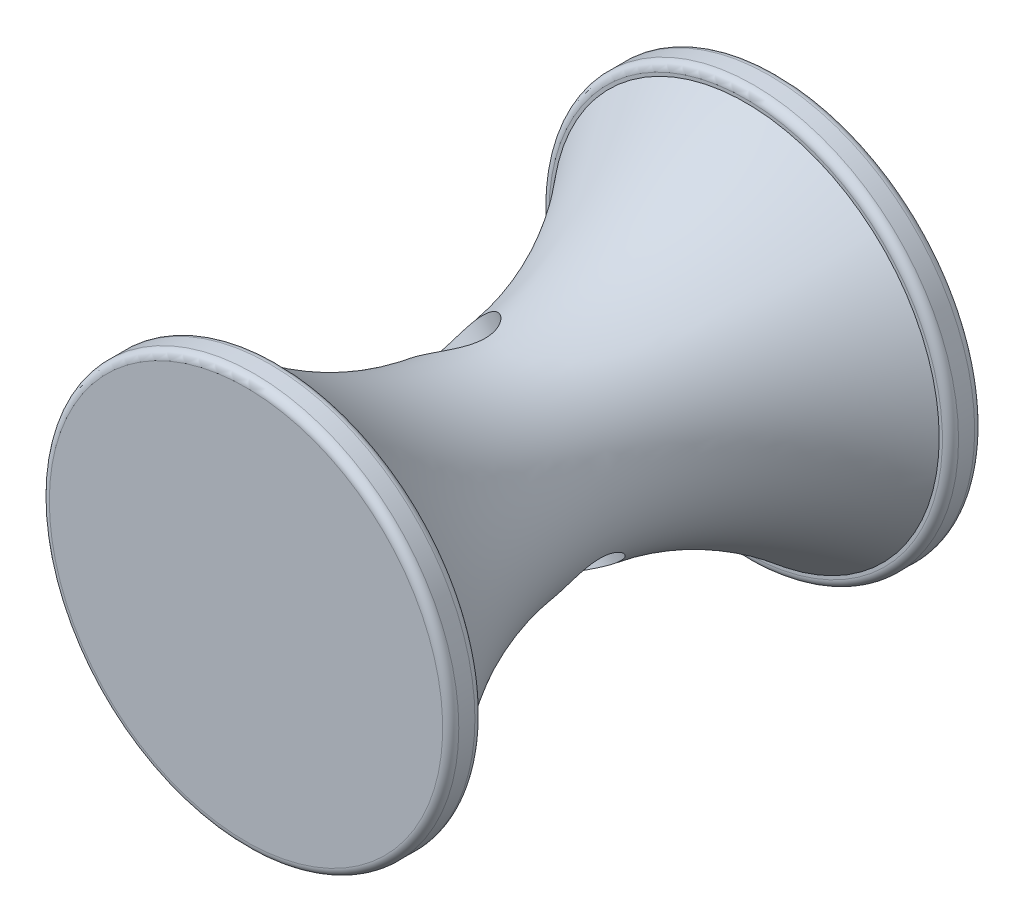
ISO-10303-21;
HEADER;
FILE_DESCRIPTION(('STEP AP214'),'2;1');
FILE_NAME('part.step','',(''),(''),'','','');
FILE_SCHEMA(('AUTOMOTIVE_DESIGN { 1 0 10303 214 1 1 1 1 }'));
ENDSEC;
DATA;
#1=APPLICATION_CONTEXT('core data for automotive mechanical design processes');
#2=APPLICATION_PROTOCOL_DEFINITION('international standard','automotive_design',2000,#1);
#3=PRODUCT_CONTEXT('',#1,'mechanical');
#4=PRODUCT('Part','Part','',(#3));
#5=PRODUCT_RELATED_PRODUCT_CATEGORY('part','',(#4));
#6=PRODUCT_DEFINITION_FORMATION('','',#4);
#7=PRODUCT_DEFINITION_CONTEXT('part definition',#1,'design');
#8=PRODUCT_DEFINITION('design','',#6,#7);
#9=PRODUCT_DEFINITION_SHAPE('','',#8);
#10=(LENGTH_UNIT() NAMED_UNIT(*) SI_UNIT(.MILLI.,.METRE.));
#11=(NAMED_UNIT(*) PLANE_ANGLE_UNIT() SI_UNIT($,.RADIAN.));
#12=(NAMED_UNIT(*) SI_UNIT($,.STERADIAN.) SOLID_ANGLE_UNIT());
#13=UNCERTAINTY_MEASURE_WITH_UNIT(LENGTH_MEASURE(1.E-05),#10,'distance_accuracy_value','');
#14=(GEOMETRIC_REPRESENTATION_CONTEXT(3) GLOBAL_UNCERTAINTY_ASSIGNED_CONTEXT((#13)) GLOBAL_UNIT_ASSIGNED_CONTEXT((#10,
#11,#12)) REPRESENTATION_CONTEXT('',''));
#15=CARTESIAN_POINT('',(0.,0.,0.));
#16=DIRECTION('',(0.,0.,1.));
#17=DIRECTION('',(1.,0.,0.));
#18=AXIS2_PLACEMENT_3D('',#15,#16,#17);
#19=CARTESIAN_POINT('',(0.,0.,-7.));
#20=DIRECTION('',(0.,0.,1.));
#21=DIRECTION('',(1.,0.,0.));
#22=AXIS2_PLACEMENT_3D('',#19,#20,#21);
#23=CYLINDRICAL_SURFACE('',#22,5.);
#24=CARTESIAN_POINT('',(0.,0.,-6.5));
#25=DIRECTION('',(0.,0.,-1.));
#26=DIRECTION('',(-1.,0.,0.));
#27=AXIS2_PLACEMENT_3D('',#24,#25,#26);
#28=CIRCLE('',#27,5.);
#29=CARTESIAN_POINT('',(-5.,0.,-6.5));
#30=VERTEX_POINT('',#29);
#31=EDGE_CURVE('E56',#30,#30,#28,.F.);
#32=ORIENTED_EDGE('',*,*,#31,.T.);
#33=EDGE_LOOP('',(#32));
#34=FACE_BOUND('',#33,.T.);
#35=CARTESIAN_POINT('',(0.,0.,-2.5));
#36=DIRECTION('',(0.,0.,-1.));
#37=DIRECTION('',(-1.,0.,0.));
#38=AXIS2_PLACEMENT_3D('',#35,#36,#37);
#39=CIRCLE('',#38,5.);
#40=CARTESIAN_POINT('',(-5.,0.,-2.5));
#41=VERTEX_POINT('',#40);
#42=EDGE_CURVE('E60',#41,#41,#39,.T.);
#43=ORIENTED_EDGE('',*,*,#42,.T.);
#44=EDGE_LOOP('',(#43));
#45=FACE_BOUND('',#44,.T.);
#46=CARTESIAN_POINT('',(-2.60900254684308,4.26533770181991,-4.5));
#47=CARTESIAN_POINT('',(-2.60900443382796,4.26533711327154,-4.4553733138568));
#48=CARTESIAN_POINT('',(-2.61224345294259,4.26336053445831,-4.41072162366317));
#49=CARTESIAN_POINT('',(-2.62507600880975,4.2554706571707,-4.32266926107481));
#50=CARTESIAN_POINT('',(-2.63467554499666,4.2495536419293,-4.27926981020067));
#51=CARTESIAN_POINT('',(-2.65983460101984,4.2338514713494,-4.19500907475503));
#52=CARTESIAN_POINT('',(-2.67538930778719,4.22406943957826,-4.1541457713407));
#53=CARTESIAN_POINT('',(-2.71185698764664,4.20074968922989,-4.07605340784582));
#54=CARTESIAN_POINT('',(-2.73276930240486,4.18721243207155,-4.03882390202596));
#55=CARTESIAN_POINT('',(-2.77937816959238,4.15642168396467,-3.96871242688156));
#56=CARTESIAN_POINT('',(-2.8051122625627,4.13913885362266,-3.93586829379598));
#57=CARTESIAN_POINT('',(-2.86034256689951,4.1011658480446,-3.87578821613603));
#58=CARTESIAN_POINT('',(-2.88983899432764,4.08047547710194,-3.84855259387972));
#59=CARTESIAN_POINT('',(-2.95176343119985,4.03590802300632,-3.8003216154833));
#60=CARTESIAN_POINT('',(-2.98420663985308,4.01201407539377,-3.77936132386475));
#61=CARTESIAN_POINT('',(-3.0508062003771,3.96160618261597,-3.74450122437601));
#62=CARTESIAN_POINT('',(-3.08496244935503,3.93509239471747,-3.73060099300373));
#63=CARTESIAN_POINT('',(-3.15359457175549,3.88030308154958,-3.71037090225503));
#64=CARTESIAN_POINT('',(-3.18806524255034,3.85204449095762,-3.70397755223796));
#65=CARTESIAN_POINT('',(-3.25655980146,3.79431464540323,-3.69874539676572));
#66=CARTESIAN_POINT('',(-3.2905837175301,3.76484346679909,-3.69990611634203));
#67=CARTESIAN_POINT('',(-3.35690513771445,3.70582531630776,-3.70969939427401));
#68=CARTESIAN_POINT('',(-3.3892155684742,3.67628149339075,-3.71826363369893));
#69=CARTESIAN_POINT('',(-3.45160590242494,3.61776824619765,-3.74251340584986));
#70=CARTESIAN_POINT('',(-3.48168574189487,3.58879883834812,-3.75819914192376));
#71=CARTESIAN_POINT('',(-3.53903429460917,3.53226078879275,-3.79631538348004));
#72=CARTESIAN_POINT('',(-3.5662905079494,3.50469862859788,-3.81877429095832));
#73=CARTESIAN_POINT('',(-3.61727478178309,3.45205274895665,-3.8697785714468));
#74=CARTESIAN_POINT('',(-3.64100257841022,3.42696921491694,-3.89832439926831));
#75=CARTESIAN_POINT('',(-3.68472454236486,3.37991864423674,-3.9610718254241));
#76=CARTESIAN_POINT('',(-3.70467398231077,3.35798960220132,-3.99533311033636));
#77=CARTESIAN_POINT('',(-3.74014960786449,3.3184317230795,-4.06833710250877));
#78=CARTESIAN_POINT('',(-3.75567575862041,3.30080291987564,-4.10707984507576));
#79=CARTESIAN_POINT('',(-3.7820516732753,3.27054893242898,-4.1880122039828));
#80=CARTESIAN_POINT('',(-3.79289687708267,3.25792862833217,-4.23020513406254));
#81=CARTESIAN_POINT('',(-3.80970250164521,3.23826123114849,-4.31680424865733));
#82=CARTESIAN_POINT('',(-3.81566331684459,3.23121368802874,-4.36121025414573));
#83=CARTESIAN_POINT('',(-3.82256033187884,3.2230515285817,-4.45045112906938));
#84=CARTESIAN_POINT('',(-3.82355115776807,3.22187241243453,-4.49527588587375));
#85=CARTESIAN_POINT('',(-3.82063914040817,3.22532501670492,-4.58453958650626));
#86=CARTESIAN_POINT('',(-3.81673647076437,3.22995653098019,-4.628978543965));
#87=CARTESIAN_POINT('',(-3.80414080015943,3.24478127374899,-4.71594676217776));
#88=CARTESIAN_POINT('',(-3.79547559320324,3.25494222924468,-4.75848556927231));
#89=CARTESIAN_POINT('',(-3.77351750854249,3.28037286859459,-4.84074815480667));
#90=CARTESIAN_POINT('',(-3.76022437368658,3.29564283632984,-4.88047177667274));
#91=CARTESIAN_POINT('',(-3.72909705437417,3.33082413724014,-4.95634895723258));
#92=CARTESIAN_POINT('',(-3.71122511058486,3.35077394147325,-4.99246918142802));
#93=CARTESIAN_POINT('',(-3.67130326423956,3.39446695827805,-5.0597704242547));
#94=CARTESIAN_POINT('',(-3.64925309168761,3.41821041597901,-5.09095112345601));
#95=CARTESIAN_POINT('',(-3.60114808870132,3.46885592523356,-5.14779091683714));
#96=CARTESIAN_POINT('',(-3.57505705745574,3.49578595125553,-5.17339449164431));
#97=CARTESIAN_POINT('',(-3.51956233548919,3.55165157383198,-5.2179652183954));
#98=CARTESIAN_POINT('',(-3.49015874533044,3.58058710949321,-5.23693257172912));
#99=CARTESIAN_POINT('',(-3.42884126323115,3.63934633375815,-5.26760508960748));
#100=CARTESIAN_POINT('',(-3.39693820900117,3.66916587358044,-5.2793398424944));
#101=CARTESIAN_POINT('',(-3.33133236744525,3.7288321698403,-5.295309534557));
#102=CARTESIAN_POINT('',(-3.29762971631576,3.75867892405067,-5.29954504046161));
#103=CARTESIAN_POINT('',(-3.22975053470155,3.81715814532049,-5.30038071923171));
#104=CARTESIAN_POINT('',(-3.19558348776587,3.8458004454421,-5.29706555976116));
#105=CARTESIAN_POINT('',(-3.12741574243433,3.90143652879362,-5.28307646469127));
#106=CARTESIAN_POINT('',(-3.09341504328036,3.92843031954281,-5.2724025626598));
#107=CARTESIAN_POINT('',(-3.02665808428816,3.98009071234288,-5.24403047006883));
#108=CARTESIAN_POINT('',(-2.99390067811688,4.00475949083369,-5.22633893118066));
#109=CARTESIAN_POINT('',(-2.93063389282212,4.05128731381145,-5.18444301584855));
#110=CARTESIAN_POINT('',(-2.90012460668067,4.07314624211108,-5.16023837021556));
#111=CARTESIAN_POINT('',(-2.84204445648546,4.11388585944119,-5.1057006718458));
#112=CARTESIAN_POINT('',(-2.81450815420948,4.13273253604469,-5.07530539880373));
#113=CARTESIAN_POINT('',(-2.76369723751501,4.16688339537049,-5.0093800524562));
#114=CARTESIAN_POINT('',(-2.74042362313658,4.18218674703944,-4.97384877771776));
#115=CARTESIAN_POINT('',(-2.69885577409325,4.20913255859979,-4.89838833042705));
#116=CARTESIAN_POINT('',(-2.68059469134936,4.22075072035152,-4.85843221987585));
#117=CARTESIAN_POINT('',(-2.64997553052222,4.24004245285957,-4.7754566841129));
#118=CARTESIAN_POINT('',(-2.63761146095782,4.2477200279359,-4.73244041937775));
#119=CARTESIAN_POINT('',(-2.62200227858149,4.25736525548576,-4.65770481675488));
#120=CARTESIAN_POINT('',(-2.61713734578481,4.26035289216209,-4.62644188261262));
#121=CARTESIAN_POINT('',(-2.61063683464042,4.26433930879072,-4.56345684217454));
#122=CARTESIAN_POINT('',(-2.60900120497825,4.26533812034597,-4.53173474318303));
#123=CARTESIAN_POINT('',(-2.60900254684308,4.26533770181991,-4.5));
#124=B_SPLINE_CURVE_WITH_KNOTS('',3,(#46,#47,#48,#49,#50,#51,#52,#53,#54,#55,#56,#57,#58,#59,
#60,#61,#62,#63,#64,#65,#66,#67,#68,#69,#70,#71,#72,#73,#74,#75,#76,#77,#78,#79,#80,#81,#82,#83,
#84,#85,#86,#87,#88,#89,#90,#91,#92,#93,#94,#95,#96,#97,#98,#99,#100,#101,#102,#103,#104,#105,
#106,#107,#108,#109,#110,#111,#112,#113,#114,#115,#116,#117,#118,#119,#120,#121,#122,#123),
.UNSPECIFIED.,.T.,.F.,(4,2,2,2,2,2,2,2,2,2,2,2,2,2,2,2,2,2,2,2,2,2,2,2,2,2,2,2,2,2,2,2,2,2,2,2,
2,2,4),(0.,0.133764032978237,0.267654416240317,0.40143681470898,0.53520278209898,
0.670057077330425,0.804919120403269,0.940521238000382,1.07611522045936,1.21055394043864,
1.34498420755128,1.47818704938263,1.61139369493982,1.74516687269947,1.87895004942165,
2.01422953733835,2.14951009111741,2.28492213686848,2.42032324619167,2.55423282532142,
2.68813765390886,2.82126919083117,2.95440812640361,3.08868247170647,3.22296549674049,
3.35852970160144,3.49408979213061,3.62909156425651,3.76408313366813,3.89756846817801,
4.03105319378108,4.16441169698711,4.29777571279495,4.43255288424274,4.56736163445245,
4.70304160363671,4.83858342408627,4.93370665764447,5.0288283796578),.UNSPECIFIED.);
#125=CARTESIAN_POINT('',(-2.60900254684308,4.26533770181991,-4.5));
#126=VERTEX_POINT('',#125);
#127=EDGE_CURVE('E193',#126,#126,#124,.T.);
#128=ORIENTED_EDGE('',*,*,#127,.T.);
#129=EDGE_LOOP('',(#128));
#130=FACE_BOUND('',#129,.T.);
#131=ADVANCED_FACE('F45',(#34,#45,#130),#23,.T.);
#132=CARTESIAN_POINT('',(0.,0.,2.));
#133=DIRECTION('',(0.,0.,-1.));
#134=DIRECTION('',(-1.,0.,0.));
#135=AXIS2_PLACEMENT_3D('',#132,#133,#134);
#136=CYLINDRICAL_SURFACE('',#135,2.);
#137=CARTESIAN_POINT('',(0.,0.,2.));
#138=DIRECTION('',(0.,0.,1.));
#139=DIRECTION('',(1.,0.,0.));
#140=AXIS2_PLACEMENT_3D('',#137,#138,#139);
#141=CIRCLE('',#140,2.);
#142=CARTESIAN_POINT('',(2.,0.,2.));
#143=VERTEX_POINT('',#142);
#144=EDGE_CURVE('E101',#143,#143,#141,.T.);
#145=ORIENTED_EDGE('',*,*,#144,.T.);
#146=EDGE_LOOP('',(#145));
#147=FACE_BOUND('',#146,.T.);
#148=CARTESIAN_POINT('',(0.,0.,-6.5));
#149=DIRECTION('',(0.,0.,-1.));
#150=DIRECTION('',(-1.,0.,0.));
#151=AXIS2_PLACEMENT_3D('',#148,#149,#150);
#152=CIRCLE('',#151,2.);
#153=CARTESIAN_POINT('',(-2.,0.,-6.5));
#154=VERTEX_POINT('',#153);
#155=EDGE_CURVE('E52',#154,#154,#152,.T.);
#156=ORIENTED_EDGE('',*,*,#155,.T.);
#157=EDGE_LOOP('',(#156));
#158=FACE_BOUND('',#157,.T.);
#159=CARTESIAN_POINT('',(-0.587474123760921,1.91177251625588,-4.5));
#160=CARTESIAN_POINT('',(-0.587480508265207,1.91177273864032,-4.45714420076004));
#161=CARTESIAN_POINT('',(-0.591095009578166,1.91067162442174,-4.41422778611812));
#162=CARTESIAN_POINT('',(-0.605331242673582,1.90620723186134,-4.32962606684917));
#163=CARTESIAN_POINT('',(-0.615970879870037,1.9028381726333,-4.2879441931678));
#164=CARTESIAN_POINT('',(-0.643533364880496,1.89369301682181,-4.20717882321198));
#165=CARTESIAN_POINT('',(-0.660432534108798,1.88792598136304,-4.1680861810559));
#166=CARTESIAN_POINT('',(-0.69960927466876,1.8737606457941,-4.09324597965615));
#167=CARTESIAN_POINT('',(-0.721885671568623,1.86536292012972,-4.05749769233965));
#168=CARTESIAN_POINT('',(-0.772115479648568,1.84515756588624,-3.98829583910342));
#169=CARTESIAN_POINT('',(-0.800303394826233,1.83319568093306,-3.95505743082821));
#170=CARTESIAN_POINT('',(-0.86040862196621,1.80576510433217,-3.89378840107385));
#171=CARTESIAN_POINT('',(-0.892327230865594,1.79029519138727,-3.86575959948406));
#172=CARTESIAN_POINT('',(-0.960030802762707,1.75495116248972,-3.81463744120692));
#173=CARTESIAN_POINT('',(-0.995918593943286,1.73492743437871,-3.79178227941174));
#174=CARTESIAN_POINT('',(-1.06905074185706,1.69084279225603,-3.75326257264408));
#175=CARTESIAN_POINT('',(-1.10629453990706,1.66678352649843,-3.73759510168722));
#176=CARTESIAN_POINT('',(-1.17887459669896,1.61620396124279,-3.71466340542504));
#177=CARTESIAN_POINT('',(-1.21421591215646,1.58985919911323,-3.70702907436439));
#178=CARTESIAN_POINT('',(-1.28354310840504,1.53443270102363,-3.69918860573492));
#179=CARTESIAN_POINT('',(-1.31752949001489,1.50535198994922,-3.69897969762606));
#180=CARTESIAN_POINT('',(-1.38120212688349,1.44707981012738,-3.70579310790999));
#181=CARTESIAN_POINT('',(-1.4110226907521,1.41798631350338,-3.71240990909877));
#182=CARTESIAN_POINT('',(-1.46778551237587,1.35914589974983,-3.7319971505243));
#183=CARTESIAN_POINT('',(-1.49472755875822,1.32939893482846,-3.74496805696016));
#184=CARTESIAN_POINT('',(-1.5456773093787,1.26981991443307,-3.77705459315052));
#185=CARTESIAN_POINT('',(-1.56963466933303,1.23999333342563,-3.79625988592621));
#186=CARTESIAN_POINT('',(-1.6139391717264,1.1817534741465,-3.8401860027676));
#187=CARTESIAN_POINT('',(-1.63428507248995,1.15334068436508,-3.86490871723905));
#188=CARTESIAN_POINT('',(-1.67256033053794,1.09716552742608,-3.92105965437864));
#189=CARTESIAN_POINT('',(-1.69024332842907,1.06956833815165,-3.95282155703353));
#190=CARTESIAN_POINT('',(-1.72158275513892,1.0183595287229,-4.02119622872839));
#191=CARTESIAN_POINT('',(-1.73523786650214,0.994749213686825,-4.05781057926167));
#192=CARTESIAN_POINT('',(-1.75898713291831,0.952143752751025,-4.13616760896358));
#193=CARTESIAN_POINT('',(-1.76896980844902,0.933297807116408,-4.17802593219353));
#194=CARTESIAN_POINT('',(-1.78493944689584,0.902384356932608,-4.26488619618481));
#195=CARTESIAN_POINT('',(-1.79092900529976,0.890312450132704,-4.30988607390834));
#196=CARTESIAN_POINT('',(-1.79875011734727,0.874398298324142,-4.39881431097442));
#197=CARTESIAN_POINT('',(-1.80081333945623,0.870098337912879,-4.44264017884807));
#198=CARTESIAN_POINT('',(-1.80151351578428,0.868648690121766,-4.53043088310718));
#199=CARTESIAN_POINT('',(-1.80015150901674,0.871496834426021,-4.57439567331114));
#200=CARTESIAN_POINT('',(-1.79416609168745,0.883747160284599,-4.65858357398195));
#201=CARTESIAN_POINT('',(-1.78973285445757,0.892766813800205,-4.6988771749598));
#202=CARTESIAN_POINT('',(-1.77776656042316,0.916362238045212,-4.7773153619144));
#203=CARTESIAN_POINT('',(-1.77023281627608,0.930939240714714,-4.81545946924293));
#204=CARTESIAN_POINT('',(-1.75161796555995,0.965522608838415,-4.8902409431182));
#205=CARTESIAN_POINT('',(-1.74040539137102,0.98572518016674,-4.92675447547778));
#206=CARTESIAN_POINT('',(-1.71442443196069,1.03024875099509,-4.99579319497667));
#207=CARTESIAN_POINT('',(-1.699654598122,1.0545714271187,-5.02831674911824));
#208=CARTESIAN_POINT('',(-1.66521702891769,1.1082146965867,-5.09094936343969));
#209=CARTESIAN_POINT('',(-1.64526809440035,1.1377717558601,-5.12070262611641));
#210=CARTESIAN_POINT('',(-1.60108177583057,1.19915197415681,-5.17407083064414));
#211=CARTESIAN_POINT('',(-1.57684421728713,1.23097522535305,-5.19768552263889));
#212=CARTESIAN_POINT('',(-1.52422267402554,1.29556077018634,-5.23801905058449));
#213=CARTESIAN_POINT('',(-1.49583968432722,1.3283228369687,-5.25473953766631));
#214=CARTESIAN_POINT('',(-1.43538728775364,1.39342447745639,-5.28061954096305));
#215=CARTESIAN_POINT('',(-1.40331989231251,1.42576427105516,-5.28978316057603));
#216=CARTESIAN_POINT('',(-1.33852953099021,1.48666950214906,-5.29980188065015));
#217=CARTESIAN_POINT('',(-1.3059858387739,1.51534353056528,-5.30116005138506));
#218=CARTESIAN_POINT('',(-1.23937683076276,1.57028912431096,-5.29685780828636));
#219=CARTESIAN_POINT('',(-1.20531174605507,1.59656105266504,-5.29119845688575));
#220=CARTESIAN_POINT('',(-1.1378420485084,1.64529517767497,-5.27338128465661));
#221=CARTESIAN_POINT('',(-1.10444929045789,1.66784961083155,-5.26142842156978));
#222=CARTESIAN_POINT('',(-1.03834332615131,1.70978858810531,-5.23157887817527));
#223=CARTESIAN_POINT('',(-1.00563024641487,1.72917254658433,-5.21368110159186));
#224=CARTESIAN_POINT('',(-0.940496322213059,1.76547966066201,-5.17155872060426));
#225=CARTESIAN_POINT('',(-0.908152273380605,1.78225621980868,-5.14708948204597));
#226=CARTESIAN_POINT('',(-0.846410476507775,1.81239391037479,-5.09288459232843));
#227=CARTESIAN_POINT('',(-0.817013955849432,1.82575362254422,-5.06314676141595));
#228=CARTESIAN_POINT('',(-0.760538926226902,1.85002253893008,-4.99707391018998));
#229=CARTESIAN_POINT('',(-0.733716572892752,1.86072884358772,-4.96044445063955));
#230=CARTESIAN_POINT('',(-0.685865914442591,1.87889487590581,-4.88282314502849));
#231=CARTESIAN_POINT('',(-0.664838290573624,1.88635422190305,-4.84183078683605));
#232=CARTESIAN_POINT('',(-0.63137263516463,1.89780220785649,-4.76038511926077));
#233=CARTESIAN_POINT('',(-0.618332869015673,1.90204234563157,-4.72021390609953));
#234=CARTESIAN_POINT('',(-0.598849918812396,1.90826814538805,-4.63820583214786));
#235=CARTESIAN_POINT('',(-0.592388354483347,1.91026009078861,-4.59637395361321));
#236=CARTESIAN_POINT('',(-0.588114454578556,1.91157522554629,-4.53624897506483));
#237=CARTESIAN_POINT('',(-0.587471422831283,1.91177242217735,-4.51812991160096));
#238=CARTESIAN_POINT('',(-0.587474123760921,1.91177251625588,-4.5));
#239=B_SPLINE_CURVE_WITH_KNOTS('',3,(#159,#160,#161,#162,#163,#164,#165,#166,#167,#168,#169,
#170,#171,#172,#173,#174,#175,#176,#177,#178,#179,#180,#181,#182,#183,#184,#185,#186,#187,#188,
#189,#190,#191,#192,#193,#194,#195,#196,#197,#198,#199,#200,#201,#202,#203,#204,#205,#206,#207,
#208,#209,#210,#211,#212,#213,#214,#215,#216,#217,#218,#219,#220,#221,#222,#223,#224,#225,#226,
#227,#228,#229,#230,#231,#232,#233,#234,#235,#236,#237,#238),.UNSPECIFIED.,.T.,.F.,(4,2,2,2,2,2,
2,2,2,2,2,2,2,2,2,2,2,2,2,2,2,2,2,2,2,2,2,2,2,2,2,2,2,2,2,2,2,2,2,4),(0.,0.128511059507061,
0.257350934328899,0.385708329317358,0.514037715295447,0.6490224731377,0.784054297393372,
0.924410676365716,1.06470986787792,1.19821673154874,1.33167378122269,1.45763457932121,
1.58360462051624,1.71147320093959,1.83938565976013,1.97569617632542,2.11205122850851,
2.25225783485831,2.39237321917645,2.52392859007372,2.6554440596078,2.77946899231662,
2.90352143458259,3.03260461858685,3.16174045807944,3.30041493696396,3.43909505938703,
3.57774194922729,3.71631350379259,3.84584415899985,3.97535520602645,4.10088797774945,
4.22644391129038,4.35754820453574,4.48870686623287,4.6279850131185,4.7672795270128,
4.89406664325235,5.02049852085302,5.07486442208293),.UNSPECIFIED.);
#240=CARTESIAN_POINT('',(-0.587474123760921,1.91177251625588,-4.5));
#241=VERTEX_POINT('',#240);
#242=EDGE_CURVE('E192',#241,#241,#239,.T.);
#243=ORIENTED_EDGE('',*,*,#242,.F.);
#244=EDGE_LOOP('',(#243));
#245=FACE_BOUND('',#244,.T.);
#246=ADVANCED_FACE('F133',(#147,#158,#245),#136,.F.);
#247=CARTESIAN_POINT('',(0.,0.,-2.));
#248=DIRECTION('',(0.,0.,-1.));
#249=DIRECTION('',(-1.,0.,0.));
#250=AXIS2_PLACEMENT_3D('',#247,#248,#249);
#251=PLANE('',#250);
#252=CARTESIAN_POINT('',(0.,0.,-2.));
#253=DIRECTION('',(0.,0.,-1.));
#254=DIRECTION('',(-1.,0.,0.));
#255=AXIS2_PLACEMENT_3D('',#252,#253,#254);
#256=CIRCLE('',#255,5.5);
#257=CARTESIAN_POINT('',(-5.5,0.,-2.));
#258=VERTEX_POINT('',#257);
#259=EDGE_CURVE('E10',#258,#258,#256,.F.);
#260=ORIENTED_EDGE('',*,*,#259,.T.);
#261=EDGE_LOOP('',(#260));
#262=FACE_BOUND('',#261,.T.);
#263=CARTESIAN_POINT('',(0.,0.,-2.));
#264=DIRECTION('',(0.,0.,-1.));
#265=DIRECTION('',(-1.,0.,0.));
#266=AXIS2_PLACEMENT_3D('',#263,#264,#265);
#267=CIRCLE('',#266,12.2);
#268=CARTESIAN_POINT('',(-12.2,0.,-2.));
#269=VERTEX_POINT('',#268);
#270=EDGE_CURVE('E74',#269,#269,#267,.T.);
#271=ORIENTED_EDGE('',*,*,#270,.T.);
#272=EDGE_LOOP('',(#271));
#273=FACE_BOUND('',#272,.T.);
#274=ADVANCED_FACE('F129',(#262,#273),#251,.T.);
#275=CARTESIAN_POINT('',(0.,0.,31.));
#276=DIRECTION('',(0.,0.,-1.));
#277=DIRECTION('',(-1.,0.,0.));
#278=AXIS2_PLACEMENT_3D('',#275,#276,#277);
#279=PLANE('',#278);
#280=CARTESIAN_POINT('',(0.,0.,31.));
#281=DIRECTION('',(0.,0.,-1.));
#282=DIRECTION('',(-1.,0.,0.));
#283=AXIS2_PLACEMENT_3D('',#280,#281,#282);
#284=CIRCLE('',#283,12.2);
#285=CARTESIAN_POINT('',(-12.2,0.,31.));
#286=VERTEX_POINT('',#285);
#287=EDGE_CURVE('E71',#286,#286,#284,.F.);
#288=ORIENTED_EDGE('',*,*,#287,.T.);
#289=EDGE_LOOP('',(#288));
#290=FACE_BOUND('',#289,.T.);
#291=ADVANCED_FACE('F125',(#290),#279,.F.);
#292=CARTESIAN_POINT('',(0.,0.,0.));
#293=DIRECTION('',(0.,0.,-1.));
#294=DIRECTION('',(-1.,0.,0.));
#295=AXIS2_PLACEMENT_3D('',#292,#293,#294);
#296=CYLINDRICAL_SURFACE('',#295,12.7);
#297=CARTESIAN_POINT('',(0.,0.,29.5));
#298=DIRECTION('',(0.,0.,-1.));
#299=DIRECTION('',(-1.,0.,0.));
#300=AXIS2_PLACEMENT_3D('',#297,#298,#299);
#301=CIRCLE('',#300,12.7);
#302=CARTESIAN_POINT('',(-12.7,0.,29.5));
#303=VERTEX_POINT('',#302);
#304=EDGE_CURVE('E86',#303,#303,#301,.F.);
#305=ORIENTED_EDGE('',*,*,#304,.T.);
#306=EDGE_LOOP('',(#305));
#307=FACE_BOUND('',#306,.T.);
#308=CARTESIAN_POINT('',(0.,0.,30.5));
#309=DIRECTION('',(0.,0.,-1.));
#310=DIRECTION('',(-1.,0.,0.));
#311=AXIS2_PLACEMENT_3D('',#308,#309,#310);
#312=CIRCLE('',#311,12.7);
#313=CARTESIAN_POINT('',(-12.7,0.,30.5));
#314=VERTEX_POINT('',#313);
#315=EDGE_CURVE('E89',#314,#314,#312,.T.);
#316=ORIENTED_EDGE('',*,*,#315,.T.);
#317=EDGE_LOOP('',(#316));
#318=FACE_BOUND('',#317,.T.);
#319=ADVANCED_FACE('F121',(#307,#318),#296,.T.);
#320=CARTESIAN_POINT('',(0.,0.,29.));
#321=DIRECTION('',(0.,0.,-1.));
#322=DIRECTION('',(-1.,0.,0.));
#323=AXIS2_PLACEMENT_3D('',#320,#321,#322);
#324=PLANE('',#323);
#325=CARTESIAN_POINT('',(0.,0.,29.));
#326=DIRECTION('',(0.,0.,-1.));
#327=DIRECTION('',(-1.,0.,0.));
#328=AXIS2_PLACEMENT_3D('',#325,#326,#327);
#329=CIRCLE('',#328,12.2);
#330=CARTESIAN_POINT('',(-12.2,0.,29.));
#331=VERTEX_POINT('',#330);
#332=EDGE_CURVE('E92',#331,#331,#329,.T.);
#333=ORIENTED_EDGE('',*,*,#332,.T.);
#334=EDGE_LOOP('',(#333));
#335=FACE_BOUND('',#334,.T.);
#336=CARTESIAN_POINT('',(0.,0.,29.));
#337=DIRECTION('',(0.,0.,-1.));
#338=DIRECTION('',(-1.,0.,0.));
#339=AXIS2_PLACEMENT_3D('',#336,#337,#338);
#340=CIRCLE('',#339,12.);
#341=CARTESIAN_POINT('',(-12.,0.,29.));
#342=VERTEX_POINT('',#341);
#343=EDGE_CURVE('E95',#342,#342,#340,.T.);
#344=ORIENTED_EDGE('',*,*,#343,.F.);
#345=EDGE_LOOP('',(#344));
#346=FACE_BOUND('',#345,.T.);
#347=ADVANCED_FACE('F116',(#335,#346),#324,.T.);
#348=CARTESIAN_POINT('',(9.1030728237083,7.81882760816885,0.));
#349=CARTESIAN_POINT('',(0.,0.,14.5));
#350=CARTESIAN_POINT('',(9.1030728237083,7.81882760816885,29.));
#351=B_SPLINE_CURVE_WITH_KNOTS('',2,(#348,#349,#350),.UNSPECIFIED.,.F.,.F.,(3,3),(0.,1.),.UNSPECIFIED.);
#352=CARTESIAN_POINT('',(0.,0.,0.));
#353=DIRECTION('',(0.,0.,-1.));
#354=AXIS1_PLACEMENT('',#352,#353);
#355=SURFACE_OF_REVOLUTION('',#351,#354);
#356=CARTESIAN_POINT('',(1.65741563887243,-5.76653911805175,14.5));
#357=CARTESIAN_POINT('',(1.65741519968673,-5.7665390552771,14.5645507052165));
#358=CARTESIAN_POINT('',(1.6603199498158,-5.76607873716281,14.6290981617678));
#359=CARTESIAN_POINT('',(1.67187240567597,-5.76421743219729,14.7576858873826));
#360=CARTESIAN_POINT('',(1.68052222305375,-5.7628160994663,14.8217259611921));
#361=CARTESIAN_POINT('',(1.70339326640207,-5.75901244708566,14.9488559935069));
#362=CARTESIAN_POINT('',(1.7176215281951,-5.75660886310066,15.0119446472706));
#363=CARTESIAN_POINT('',(1.7513522717313,-5.75070883913876,15.136653025071));
#364=CARTESIAN_POINT('',(1.77085705317798,-5.7472119225431,15.1982720958365));
#365=CARTESIAN_POINT('',(1.83649615442742,-5.7349532035872,15.3795857826718));
#366=CARTESIAN_POINT('',(1.88991716421209,-5.7244009550915,15.4965965401044));
#367=CARTESIAN_POINT('',(2.01294491890317,-5.69735292269355,15.7208656602847));
#368=CARTESIAN_POINT('',(2.08255409862925,-5.68085624450012,15.8281225526003));
#369=CARTESIAN_POINT('',(2.24166390084234,-5.63873525046294,16.040596964333));
#370=CARTESIAN_POINT('',(2.33239083529211,-5.61242314019256,16.1447624015178));
#371=CARTESIAN_POINT('',(2.52552772382354,-5.54931923735634,16.3380513245705));
#372=CARTESIAN_POINT('',(2.62794480262401,-5.51252103323255,16.4271655543552));
#373=CARTESIAN_POINT('',(2.84974191466528,-5.42314604622644,16.5951546517706));
#374=CARTESIAN_POINT('',(2.96982432486466,-5.36951568230901,16.6725723021483));
#375=CARTESIAN_POINT('',(3.15311802208088,-5.27739422453764,16.7715654557071));
#376=CARTESIAN_POINT('',(3.21476597087784,-5.24472786893529,16.8017150232487));
#377=CARTESIAN_POINT('',(3.33848059284802,-5.17543937190754,16.8559694170766));
#378=CARTESIAN_POINT('',(3.40054699220238,-5.13881961888331,16.8800778641213));
#379=CARTESIAN_POINT('',(3.51960183347521,-5.06465811405049,16.9202993668152));
#380=CARTESIAN_POINT('',(3.57661162184799,-5.02740690506729,16.9368867083978));
#381=CARTESIAN_POINT('',(3.68979465429563,-4.94973690444249,16.9644103195822));
#382=CARTESIAN_POINT('',(3.74596831649957,-4.90931976400094,16.9753495126859));
#383=CARTESIAN_POINT('',(3.85691860702072,-4.82555756873938,16.9914229879023));
#384=CARTESIAN_POINT('',(3.91169579615424,-4.78221371562515,16.9965596373587));
#385=CARTESIAN_POINT('',(4.01932314851349,-4.69294823912708,17.0009643326841));
#386=CARTESIAN_POINT('',(4.0721734638364,-4.64702681993245,17.0002328427647));
#387=CARTESIAN_POINT('',(4.21629106353433,-4.51585291741611,16.9899908190095));
#388=CARTESIAN_POINT('',(4.30497195808349,-4.4281530236788,16.9740095048775));
#389=CARTESIAN_POINT('',(4.47250101126933,-4.24874542678377,16.9239671774014));
#390=CARTESIAN_POINT('',(4.55134815072211,-4.15703730953622,16.8899042919782));
#391=CARTESIAN_POINT('',(4.69917710003751,-3.97152896633645,16.8045671693615));
#392=CARTESIAN_POINT('',(4.76801680793211,-3.87771705475956,16.7530742187287));
#393=CARTESIAN_POINT('',(4.89446902398714,-3.69226822129135,16.634639626483));
#394=CARTESIAN_POINT('',(4.95207743294117,-3.60063210419927,16.5676923637437));
#395=CARTESIAN_POINT('',(5.03325084710004,-3.46222089030035,16.4529096867035));
#396=CARTESIAN_POINT('',(5.06056286373026,-3.4136169463527,16.4098135645499));
#397=CARTESIAN_POINT('',(5.11200207745199,-3.31849450818681,16.3196191881187));
#398=CARTESIAN_POINT('',(5.13613017548257,-3.27197542649554,16.2725220722116));
#399=CARTESIAN_POINT('',(5.18135557548503,-3.18149460151099,16.1745302428695));
#400=CARTESIAN_POINT('',(5.20245193812333,-3.13753365331324,16.123634359838));
#401=CARTESIAN_POINT('',(5.241780803605,-3.05264216997129,16.0182345349111));
#402=CARTESIAN_POINT('',(5.26000906702221,-3.01171616721409,15.9637254181058));
#403=CARTESIAN_POINT('',(5.31318713751265,-2.88830055374214,15.786436204014));
#404=CARTESIAN_POINT('',(5.34319237245029,-2.81227817153822,15.6573857355511));
#405=CARTESIAN_POINT('',(5.37961177292178,-2.71515119212744,15.4544942192805));
#406=CARTESIAN_POINT('',(5.3903209163943,-2.68559082344187,15.3853024184539));
#407=CARTESIAN_POINT('',(5.40903335471918,-2.63274606615961,15.2442231481212));
#408=CARTESIAN_POINT('',(5.41703861632173,-2.60945711836612,15.1723376804018));
#409=CARTESIAN_POINT('',(5.42989746342952,-2.5714216451389,15.032495457824));
#410=CARTESIAN_POINT('',(5.43495705338226,-2.55612765602075,14.9647059284983));
#411=CARTESIAN_POINT('',(5.44295034116685,-2.53173752134873,14.8279478072773));
#412=CARTESIAN_POINT('',(5.44588583823478,-2.52263613067777,14.7589802640469));
#413=CARTESIAN_POINT('',(5.44967153472901,-2.51086576087168,14.6204731111409));
#414=CARTESIAN_POINT('',(5.45052272294496,-2.50819373167791,14.5509337884319));
#415=CARTESIAN_POINT('',(5.45015317777375,-2.50934927627389,14.4119041681529));
#416=CARTESIAN_POINT('',(5.44893218902266,-2.51317765113848,14.3424138776811));
#417=CARTESIAN_POINT('',(5.44468914179057,-2.52633776081123,14.2128994651677));
#418=CARTESIAN_POINT('',(5.44191423733243,-2.53491273236628,14.1527890289334));
#419=CARTESIAN_POINT('',(5.43474598879695,-2.55675556000342,14.0335181460893));
#420=CARTESIAN_POINT('',(5.43035211229943,-2.57002495985251,13.9743580186879));
#421=CARTESIAN_POINT('',(5.41468288760158,-2.61651183337005,13.7988901289243));
#422=CARTESIAN_POINT('',(5.40091728192576,-2.65641718924321,13.6845092660203));
#423=CARTESIAN_POINT('',(5.3656047486481,-2.75326175542939,13.4590482684833));
#424=CARTESIAN_POINT('',(5.343767098916,-2.81082156687938,13.3482859645026));
#425=CARTESIAN_POINT('',(5.29166135574162,-2.93912270863495,13.1367243513831));
#426=CARTESIAN_POINT('',(5.26138706387865,-3.00987371784738,13.0359324415715));
#427=CARTESIAN_POINT('',(5.20656689399092,-3.12886599386253,12.8866170214722));
#428=CARTESIAN_POINT('',(5.18512792062362,-3.17375665451078,12.8342078550949));
#429=CARTESIAN_POINT('',(5.13908692427272,-3.26622466789516,12.7333969760212));
#430=CARTESIAN_POINT('',(5.11448785736478,-3.3137994867304,12.6849915867304));
#431=CARTESIAN_POINT('',(5.03563526999523,-3.45989969785195,12.5460001242065));
#432=CARTESIAN_POINT('',(4.97633491983366,-3.56178149431265,12.4616626714993));
#433=CARTESIAN_POINT('',(4.84013039297001,-3.77504884569984,12.3085225724197));
#434=CARTESIAN_POINT('',(4.76253237178053,-3.88665603128049,12.2406314165356));
#435=CARTESIAN_POINT('',(4.63432748950327,-4.05372641828529,12.1566738321506));
#436=CARTESIAN_POINT('',(4.58961965302428,-4.10936518605654,12.1316662735034));
#437=CARTESIAN_POINT('',(4.49637199891482,-4.21991486677514,12.0879053294312));
#438=CARTESIAN_POINT('',(4.44783268372861,-4.27482587405865,12.0691511256467));
#439=CARTESIAN_POINT('',(4.35222622598862,-4.37779962034407,12.0397421909722));
#440=CARTESIAN_POINT('',(4.30549579959484,-4.42599880785547,12.0284658269979));
#441=CARTESIAN_POINT('',(4.20944473459463,-4.52075381135893,12.0113724601669));
#442=CARTESIAN_POINT('',(4.16012435685519,-4.56730979207244,12.0055549085931));
#443=CARTESIAN_POINT('',(4.05927942164735,-4.65831700361193,11.9994661294546));
#444=CARTESIAN_POINT('',(4.00775573935432,-4.70276905562679,11.9991927198335));
#445=CARTESIAN_POINT('',(3.90295128731851,-4.78919074753418,12.0041825452032));
#446=CARTESIAN_POINT('',(3.84967059640941,-4.83116049856751,12.0094455321127));
#447=CARTESIAN_POINT('',(3.6972814856383,-4.94581683087715,12.0320632288218));
#448=CARTESIAN_POINT('',(3.59661558268976,-5.0152917501665,12.0558103729479));
#449=CARTESIAN_POINT('',(3.39424963633495,-5.14374784848381,12.1205155454297));
#450=CARTESIAN_POINT('',(3.29254944073651,-5.20272745884043,12.1614761435075));
#451=CARTESIAN_POINT('',(3.08706345394514,-5.31227413689496,12.2610881028401));
#452=CARTESIAN_POINT('',(2.98336053810021,-5.36240262398874,12.3203899864032));
#453=CARTESIAN_POINT('',(2.78127835034423,-5.45184131508655,12.4542305247526));
#454=CARTESIAN_POINT('',(2.68290155995577,-5.49114651061615,12.5287762058895));
#455=CARTESIAN_POINT('',(2.48346050037296,-5.56407173973723,12.7009505748797));
#456=CARTESIAN_POINT('',(2.38340252904494,-5.59650760647073,12.8002521543217));
#457=CARTESIAN_POINT('',(2.19748822625216,-5.65124776212687,13.013966440456));
#458=CARTESIAN_POINT('',(2.11164658593893,-5.67354161133054,13.1283945620915));
#459=CARTESIAN_POINT('',(1.95467326423663,-5.71085901604043,13.3766751169821));
#460=CARTESIAN_POINT('',(1.88450938755068,-5.72545611014262,13.5112186785408));
#461=CARTESIAN_POINT('',(1.79888767703936,-5.74205569159734,13.7210878288762));
#462=CARTESIAN_POINT('',(1.77363052658833,-5.74670455524874,13.7923245929883));
#463=CARTESIAN_POINT('',(1.73018746055425,-5.7544572853216,13.9369896470596));
#464=CARTESIAN_POINT('',(1.71199700160434,-5.75756214478594,14.0104164961426));
#465=CARTESIAN_POINT('',(1.68431341703776,-5.76219735771263,14.1529601710637));
#466=CARTESIAN_POINT('',(1.67425013503142,-5.76383208577027,14.2219634640717));
#467=CARTESIAN_POINT('',(1.66080135813333,-5.76600302035577,14.3606457495913));
#468=CARTESIAN_POINT('',(1.65741611292404,-5.76653918580994,14.4303247672693));
#469=CARTESIAN_POINT('',(1.65741563887243,-5.76653911805175,14.5));
#470=B_SPLINE_CURVE_WITH_KNOTS('',3,(#356,#357,#358,#359,#360,#361,#362,#363,#364,#365,#366,
#367,#368,#369,#370,#371,#372,#373,#374,#375,#376,#377,#378,#379,#380,#381,#382,#383,#384,#385,
#386,#387,#388,#389,#390,#391,#392,#393,#394,#395,#396,#397,#398,#399,#400,#401,#402,#403,#404,
#405,#406,#407,#408,#409,#410,#411,#412,#413,#414,#415,#416,#417,#418,#419,#420,#421,#422,#423,
#424,#425,#426,#427,#428,#429,#430,#431,#432,#433,#434,#435,#436,#437,#438,#439,#440,#441,#442,
#443,#444,#445,#446,#447,#448,#449,#450,#451,#452,#453,#454,#455,#456,#457,#458,#459,#460,#461,
#462,#463,#464,#465,#466,#467,#468,#469),.UNSPECIFIED.,.T.,.F.,(4,2,2,2,2,2,2,2,2,2,2,2,2,2,2,2,
2,2,2,2,2,2,2,2,2,2,2,2,2,2,2,2,2,2,2,2,2,2,2,2,2,2,2,2,2,2,2,2,2,2,2,2,2,2,2,2,4),(0.,
0.193579883373023,0.387230958028074,0.581127065229916,0.775107816094899,1.16047745126714,
1.54590508639343,1.96601683592734,2.38638600941114,2.84153559700398,3.0692667623004,
3.29686110820771,3.50684656050906,3.71672321435547,3.92651421097472,4.13628861179738,
4.51156077686608,4.88687180339416,5.26707848417759,5.64742367430575,5.85863906390402,
6.06979455808737,6.28101533494011,6.49254544872471,6.94790036150675,7.17563123120022,
7.40319609543296,7.61192750309294,7.8204818948948,8.02893732995753,8.2374184558114,
8.4195484448134,8.60173838318611,8.96586299312778,9.34463407371724,9.72368417532951,
9.94025883706867,10.1566323618151,10.5894740954855,11.0425680609564,11.2691589266581,
11.4957201273789,11.6996654067308,11.9035901834106,12.1074346980752,12.3112700790287,
12.6832028946699,13.0551912542876,13.4422770363493,13.8295416423524,14.2616189206932,
14.6941399583939,15.1486148322579,15.3754792194958,15.6021975071427,15.8111374268855,
16.0200851584516),.UNSPECIFIED.);
#471=CARTESIAN_POINT('',(1.65741563887243,-5.76653911805175,14.5));
#472=VERTEX_POINT('',#471);
#473=EDGE_CURVE('E191',#472,#472,#470,.T.);
#474=ORIENTED_EDGE('',*,*,#473,.T.);
#475=EDGE_LOOP('',(#474));
#476=FACE_BOUND('',#475,.T.);
#477=CARTESIAN_POINT('',(-1.65741563887243,5.76653911805175,14.5));
#478=CARTESIAN_POINT('',(-1.65741519968673,5.7665390552771,14.4354492947835));
#479=CARTESIAN_POINT('',(-1.6603199498158,5.76607873716281,14.3709018382322));
#480=CARTESIAN_POINT('',(-1.67187240567597,5.76421743219729,14.2423141126174));
#481=CARTESIAN_POINT('',(-1.68052222305375,5.7628160994663,14.1782740388079));
#482=CARTESIAN_POINT('',(-1.70339326640207,5.75901244708565,14.0511440064931));
#483=CARTESIAN_POINT('',(-1.7176215281951,5.75660886310066,13.9880553527294));
#484=CARTESIAN_POINT('',(-1.7513522717313,5.75070883913877,13.863346974929));
#485=CARTESIAN_POINT('',(-1.77085705317798,5.7472119225431,13.8017279041635));
#486=CARTESIAN_POINT('',(-1.83649615442742,5.7349532035872,13.6204142173282));
#487=CARTESIAN_POINT('',(-1.88991716421209,5.7244009550915,13.5034034598956));
#488=CARTESIAN_POINT('',(-2.01294491890317,5.69735292269356,13.2791343397153));
#489=CARTESIAN_POINT('',(-2.08255409862925,5.68085624450012,13.1718774473997));
#490=CARTESIAN_POINT('',(-2.24166390084234,5.63873525046294,12.959403035667));
#491=CARTESIAN_POINT('',(-2.33239083529211,5.61242314019256,12.8552375984822));
#492=CARTESIAN_POINT('',(-2.52552772382354,5.54931923735634,12.6619486754295));
#493=CARTESIAN_POINT('',(-2.627944802624,5.51252103323256,12.5728344456448));
#494=CARTESIAN_POINT('',(-2.84974191466527,5.42314604622644,12.4048453482294));
#495=CARTESIAN_POINT('',(-2.96982432486465,5.36951568230901,12.3274276978517));
#496=CARTESIAN_POINT('',(-3.15311802208087,5.27739422453764,12.2284345442929));
#497=CARTESIAN_POINT('',(-3.21476597087784,5.24472786893529,12.1982849767513));
#498=CARTESIAN_POINT('',(-3.33848059284801,5.17543937190755,12.1440305829234));
#499=CARTESIAN_POINT('',(-3.40054699220238,5.13881961888331,12.1199221358787));
#500=CARTESIAN_POINT('',(-3.51960183347521,5.06465811405049,12.0797006331848));
#501=CARTESIAN_POINT('',(-3.57661162184799,5.02740690506729,12.0631132916023));
#502=CARTESIAN_POINT('',(-3.68979465429563,4.94973690444249,12.0355896804178));
#503=CARTESIAN_POINT('',(-3.74596831649957,4.90931976400094,12.0246504873141));
#504=CARTESIAN_POINT('',(-3.85691860702071,4.82555756873938,12.0085770120977));
#505=CARTESIAN_POINT('',(-3.91169579615424,4.78221371562515,12.0034403626413));
#506=CARTESIAN_POINT('',(-4.01932314851349,4.69294823912709,11.9990356673159));
#507=CARTESIAN_POINT('',(-4.07217346383639,4.64702681993245,11.9997671572353));
#508=CARTESIAN_POINT('',(-4.21629106353433,4.51585291741612,12.0100091809905));
#509=CARTESIAN_POINT('',(-4.30497195808349,4.4281530236788,12.0259904951225));
#510=CARTESIAN_POINT('',(-4.47250101126933,4.24874542678378,12.0760328225986));
#511=CARTESIAN_POINT('',(-4.5513481507221,4.15703730953622,12.1100957080218));
#512=CARTESIAN_POINT('',(-4.69917710003751,3.97152896633646,12.1954328306385));
#513=CARTESIAN_POINT('',(-4.7680168079321,3.87771705475956,12.2469257812713));
#514=CARTESIAN_POINT('',(-4.89446902398713,3.69226822129135,12.365360373517));
#515=CARTESIAN_POINT('',(-4.95207743294117,3.60063210419927,12.4323076362563));
#516=CARTESIAN_POINT('',(-5.03325084710004,3.46222089030035,12.5470903132965));
#517=CARTESIAN_POINT('',(-5.06056286373025,3.41361694635271,12.5901864354501));
#518=CARTESIAN_POINT('',(-5.11200207745198,3.31849450818682,12.6803808118813));
#519=CARTESIAN_POINT('',(-5.13613017548257,3.27197542649554,12.7274779277884));
#520=CARTESIAN_POINT('',(-5.18135557548502,3.18149460151099,12.8254697571305));
#521=CARTESIAN_POINT('',(-5.20245193812332,3.13753365331324,12.876365640162));
#522=CARTESIAN_POINT('',(-5.241780803605,3.0526421699713,12.9817654650889));
#523=CARTESIAN_POINT('',(-5.26000906702221,3.0117161672141,13.0362745818942));
#524=CARTESIAN_POINT('',(-5.31318713751265,2.88830055374214,13.213563795986));
#525=CARTESIAN_POINT('',(-5.34319237245029,2.81227817153822,13.3426142644489));
#526=CARTESIAN_POINT('',(-5.37961177292178,2.71515119212744,13.5455057807195));
#527=CARTESIAN_POINT('',(-5.3903209163943,2.68559082344187,13.6146975815461));
#528=CARTESIAN_POINT('',(-5.40903335471918,2.63274606615961,13.7557768518788));
#529=CARTESIAN_POINT('',(-5.41703861632172,2.60945711836613,13.8276623195982));
#530=CARTESIAN_POINT('',(-5.42989746342952,2.57142164513891,13.967504542176));
#531=CARTESIAN_POINT('',(-5.43495705338226,2.55612765602075,14.0352940715017));
#532=CARTESIAN_POINT('',(-5.44295034116685,2.53173752134873,14.1720521927226));
#533=CARTESIAN_POINT('',(-5.44588583823478,2.52263613067777,14.2410197359531));
#534=CARTESIAN_POINT('',(-5.44967153472901,2.51086576087168,14.3795268888591));
#535=CARTESIAN_POINT('',(-5.45052272294496,2.50819373167791,14.4490662115681));
#536=CARTESIAN_POINT('',(-5.45015317777375,2.50934927627389,14.5880958318471));
#537=CARTESIAN_POINT('',(-5.44893218902266,2.51317765113847,14.6575861223188));
#538=CARTESIAN_POINT('',(-5.44468914179057,2.52633776081122,14.7871005348323));
#539=CARTESIAN_POINT('',(-5.44191423733243,2.53491273236628,14.8472109710666));
#540=CARTESIAN_POINT('',(-5.43474598879695,2.55675556000342,14.9664818539107));
#541=CARTESIAN_POINT('',(-5.43035211229943,2.57002495985251,15.0256419813121));
#542=CARTESIAN_POINT('',(-5.41468288760158,2.61651183337005,15.2011098710757));
#543=CARTESIAN_POINT('',(-5.40091728192576,2.65641718924321,15.3154907339797));
#544=CARTESIAN_POINT('',(-5.3656047486481,2.75326175542939,15.5409517315167));
#545=CARTESIAN_POINT('',(-5.34376709891599,2.81082156687938,15.6517140354974));
#546=CARTESIAN_POINT('',(-5.29166135574163,2.93912270863494,15.8632756486169));
#547=CARTESIAN_POINT('',(-5.26138706387866,3.00987371784738,15.9640675584285));
#548=CARTESIAN_POINT('',(-5.20656689399093,3.12886599386252,16.1133829785278));
#549=CARTESIAN_POINT('',(-5.18512792062362,3.17375665451077,16.1657921449051));
#550=CARTESIAN_POINT('',(-5.13908692427272,3.26622466789515,16.2666030239788));
#551=CARTESIAN_POINT('',(-5.11448785736478,3.31379948673039,16.3150084132696));
#552=CARTESIAN_POINT('',(-5.03563526999523,3.45989969785195,16.4539998757935));
#553=CARTESIAN_POINT('',(-4.97633491983366,3.56178149431264,16.5383373285007));
#554=CARTESIAN_POINT('',(-4.84013039297001,3.77504884569984,16.6914774275803));
#555=CARTESIAN_POINT('',(-4.76253237178053,3.88665603128048,16.7593685834644));
#556=CARTESIAN_POINT('',(-4.63432748950327,4.05372641828528,16.8433261678494));
#557=CARTESIAN_POINT('',(-4.58961965302429,4.10936518605654,16.8683337264966));
#558=CARTESIAN_POINT('',(-4.49637199891483,4.21991486677513,16.9120946705688));
#559=CARTESIAN_POINT('',(-4.44783268372861,4.27482587405865,16.9308488743533));
#560=CARTESIAN_POINT('',(-4.35222622598863,4.37779962034407,16.9602578090278));
#561=CARTESIAN_POINT('',(-4.30549579959485,4.42599880785547,16.9715341730021));
#562=CARTESIAN_POINT('',(-4.20944473459464,4.52075381135893,16.9886275398331));
#563=CARTESIAN_POINT('',(-4.16012435685519,4.56730979207244,16.9944450914069));
#564=CARTESIAN_POINT('',(-4.05927942164736,4.65831700361192,17.0005338705454));
#565=CARTESIAN_POINT('',(-4.00775573935433,4.70276905562679,17.0008072801665));
#566=CARTESIAN_POINT('',(-3.90295128731851,4.78919074753418,16.9958174547968));
#567=CARTESIAN_POINT('',(-3.84967059640941,4.83116049856751,16.9905544678873));
#568=CARTESIAN_POINT('',(-3.69728148563831,4.94581683087715,16.9679367711782));
#569=CARTESIAN_POINT('',(-3.59661558268977,5.01529175016649,16.9441896270521));
#570=CARTESIAN_POINT('',(-3.39424963633496,5.1437478484838,16.8794844545703));
#571=CARTESIAN_POINT('',(-3.29254944073652,5.20272745884043,16.8385238564925));
#572=CARTESIAN_POINT('',(-3.08706345394514,5.31227413689496,16.7389118971599));
#573=CARTESIAN_POINT('',(-2.98336053810022,5.36240262398873,16.6796100135968));
#574=CARTESIAN_POINT('',(-2.78127835034423,5.45184131508655,16.5457694752474));
#575=CARTESIAN_POINT('',(-2.68290155995577,5.49114651061615,16.4712237941105));
#576=CARTESIAN_POINT('',(-2.48346050037297,5.56407173973723,16.2990494251203));
#577=CARTESIAN_POINT('',(-2.38340252904494,5.59650760647072,16.1997478456783));
#578=CARTESIAN_POINT('',(-2.19748822625216,5.65124776212687,15.986033559544));
#579=CARTESIAN_POINT('',(-2.11164658593893,5.67354161133054,15.8716054379085));
#580=CARTESIAN_POINT('',(-1.95467326423663,5.71085901604043,15.6233248830179));
#581=CARTESIAN_POINT('',(-1.88450938755068,5.72545611014263,15.4887813214592));
#582=CARTESIAN_POINT('',(-1.79888767703936,5.74205569159734,15.2789121711238));
#583=CARTESIAN_POINT('',(-1.77363052658833,5.74670455524874,15.2076754070117));
#584=CARTESIAN_POINT('',(-1.73018746055426,5.7544572853216,15.0630103529404));
#585=CARTESIAN_POINT('',(-1.71199700160434,5.75756214478594,14.9895835038574));
#586=CARTESIAN_POINT('',(-1.68431341703776,5.76219735771263,14.8470398289363));
#587=CARTESIAN_POINT('',(-1.67425013503142,5.76383208577027,14.7780365359283));
#588=CARTESIAN_POINT('',(-1.66080135813333,5.76600302035577,14.6393542504087));
#589=CARTESIAN_POINT('',(-1.65741611292404,5.76653918580994,14.5696752327307));
#590=CARTESIAN_POINT('',(-1.65741563887243,5.76653911805175,14.5));
#591=B_SPLINE_CURVE_WITH_KNOTS('',3,(#477,#478,#479,#480,#481,#482,#483,#484,#485,#486,#487,
#488,#489,#490,#491,#492,#493,#494,#495,#496,#497,#498,#499,#500,#501,#502,#503,#504,#505,#506,
#507,#508,#509,#510,#511,#512,#513,#514,#515,#516,#517,#518,#519,#520,#521,#522,#523,#524,#525,
#526,#527,#528,#529,#530,#531,#532,#533,#534,#535,#536,#537,#538,#539,#540,#541,#542,#543,#544,
#545,#546,#547,#548,#549,#550,#551,#552,#553,#554,#555,#556,#557,#558,#559,#560,#561,#562,#563,
#564,#565,#566,#567,#568,#569,#570,#571,#572,#573,#574,#575,#576,#577,#578,#579,#580,#581,#582,
#583,#584,#585,#586,#587,#588,#589,#590),.UNSPECIFIED.,.T.,.F.,(4,2,2,2,2,2,2,2,2,2,2,2,2,2,2,2,
2,2,2,2,2,2,2,2,2,2,2,2,2,2,2,2,2,2,2,2,2,2,2,2,2,2,2,2,2,2,2,2,2,2,2,2,2,2,2,2,4),(0.,
0.193579883373019,0.387230958028068,0.581127065229913,0.775107816094893,1.16047745126713,
1.54590508639342,1.96601683592733,2.38638600941113,2.84153559700397,3.06926676230039,
3.2968611082077,3.50684656050905,3.71672321435547,3.92651421097472,4.13628861179738,
4.51156077686607,4.88687180339415,5.26707848417758,5.64742367430575,5.85863906390401,
6.06979455808737,6.28101533494011,6.4925454487247,6.94790036150675,7.17563123120021,
7.40319609543296,7.61192750309294,7.8204818948948,8.02893732995753,8.2374184558114,
8.41954844481339,8.6017383831861,8.96586299312777,9.34463407371724,9.7236841753295,
9.94025883706867,10.1566323618151,10.5894740954855,11.0425680609563,11.2691589266581,
11.4957201273789,11.6996654067307,11.9035901834106,12.1074346980752,12.3112700790287,
12.6832028946699,13.0551912542876,13.4422770363493,13.8295416423524,14.2616189206932,
14.6941399583939,15.1486148322579,15.3754792194958,15.6021975071427,15.8111374268855,
16.0200851584516),.UNSPECIFIED.);
#592=CARTESIAN_POINT('',(-1.65741563887243,5.76653911805175,14.5));
#593=VERTEX_POINT('',#592);
#594=EDGE_CURVE('E185',#593,#593,#591,.T.);
#595=ORIENTED_EDGE('',*,*,#594,.F.);
#596=EDGE_LOOP('',(#595));
#597=FACE_BOUND('',#596,.T.);
#598=ORIENTED_EDGE('',*,*,#343,.T.);
#599=EDGE_LOOP('',(#598));
#600=FACE_BOUND('',#599,.T.);
#601=CARTESIAN_POINT('',(0.,0.,0.));
#602=DIRECTION('',(0.,0.,-1.));
#603=DIRECTION('',(-1.,0.,0.));
#604=AXIS2_PLACEMENT_3D('',#601,#602,#603);
#605=CIRCLE('',#604,12.);
#606=CARTESIAN_POINT('',(-12.,0.,0.));
#607=VERTEX_POINT('',#606);
#608=EDGE_CURVE('E98',#607,#607,#605,.T.);
#609=ORIENTED_EDGE('',*,*,#608,.F.);
#610=EDGE_LOOP('',(#609));
#611=FACE_BOUND('',#610,.T.);
#612=ADVANCED_FACE('F111',(#476,#597,#600,#611),#355,.F.);
#613=CARTESIAN_POINT('',(0.,0.,0.));
#614=DIRECTION('',(0.,0.,-1.));
#615=DIRECTION('',(-1.,0.,0.));
#616=AXIS2_PLACEMENT_3D('',#613,#614,#615);
#617=PLANE('',#616);
#618=CARTESIAN_POINT('',(0.,0.,0.));
#619=DIRECTION('',(0.,0.,-1.));
#620=DIRECTION('',(-1.,0.,0.));
#621=AXIS2_PLACEMENT_3D('',#618,#619,#620);
#622=CIRCLE('',#621,12.2);
#623=CARTESIAN_POINT('',(-12.2,0.,0.));
#624=VERTEX_POINT('',#623);
#625=EDGE_CURVE('E77',#624,#624,#622,.F.);
#626=ORIENTED_EDGE('',*,*,#625,.T.);
#627=EDGE_LOOP('',(#626));
#628=FACE_BOUND('',#627,.T.);
#629=ORIENTED_EDGE('',*,*,#608,.T.);
#630=EDGE_LOOP('',(#629));
#631=FACE_BOUND('',#630,.T.);
#632=ADVANCED_FACE('F115',(#628,#631),#617,.F.);
#633=CARTESIAN_POINT('',(0.,0.,0.));
#634=DIRECTION('',(0.,0.,-1.));
#635=DIRECTION('',(-1.,0.,0.));
#636=AXIS2_PLACEMENT_3D('',#633,#634,#635);
#637=CYLINDRICAL_SURFACE('',#636,12.7);
#638=CARTESIAN_POINT('',(0.,0.,-0.5));
#639=DIRECTION('',(0.,0.,-1.));
#640=DIRECTION('',(-1.,0.,0.));
#641=AXIS2_PLACEMENT_3D('',#638,#639,#640);
#642=CIRCLE('',#641,12.7);
#643=CARTESIAN_POINT('',(-12.7,0.,-0.5));
#644=VERTEX_POINT('',#643);
#645=EDGE_CURVE('E80',#644,#644,#642,.T.);
#646=ORIENTED_EDGE('',*,*,#645,.T.);
#647=EDGE_LOOP('',(#646));
#648=FACE_BOUND('',#647,.T.);
#649=CARTESIAN_POINT('',(0.,0.,-1.5));
#650=DIRECTION('',(0.,0.,-1.));
#651=DIRECTION('',(-1.,0.,0.));
#652=AXIS2_PLACEMENT_3D('',#649,#650,#651);
#653=CIRCLE('',#652,12.7);
#654=CARTESIAN_POINT('',(-12.7,0.,-1.5));
#655=VERTEX_POINT('',#654);
#656=EDGE_CURVE('E83',#655,#655,#653,.F.);
#657=ORIENTED_EDGE('',*,*,#656,.T.);
#658=EDGE_LOOP('',(#657));
#659=FACE_BOUND('',#658,.T.);
#660=ADVANCED_FACE('F138',(#648,#659),#637,.T.);
#661=CARTESIAN_POINT('',(0.,0.,29.5));
#662=DIRECTION('',(0.,0.,-1.));
#663=DIRECTION('',(-1.,0.,0.));
#664=AXIS2_PLACEMENT_3D('',#661,#662,#663);
#665=TOROIDAL_SURFACE('',#664,12.2,0.5);
#666=ORIENTED_EDGE('',*,*,#304,.F.);
#667=EDGE_LOOP('',(#666));
#668=FACE_BOUND('',#667,.T.);
#669=ORIENTED_EDGE('',*,*,#332,.F.);
#670=EDGE_LOOP('',(#669));
#671=FACE_BOUND('',#670,.T.);
#672=ADVANCED_FACE('F134',(#668,#671),#665,.T.);
#673=CARTESIAN_POINT('',(0.,0.,-0.5));
#674=DIRECTION('',(0.,0.,-1.));
#675=DIRECTION('',(-1.,0.,0.));
#676=AXIS2_PLACEMENT_3D('',#673,#674,#675);
#677=TOROIDAL_SURFACE('',#676,12.2,0.5);
#678=ORIENTED_EDGE('',*,*,#625,.F.);
#679=EDGE_LOOP('',(#678));
#680=FACE_BOUND('',#679,.T.);
#681=ORIENTED_EDGE('',*,*,#645,.F.);
#682=EDGE_LOOP('',(#681));
#683=FACE_BOUND('',#682,.T.);
#684=ADVANCED_FACE('F137',(#680,#683),#677,.T.);
#685=CARTESIAN_POINT('',(0.,0.,-1.5));
#686=DIRECTION('',(0.,0.,-1.));
#687=DIRECTION('',(-1.,0.,0.));
#688=AXIS2_PLACEMENT_3D('',#685,#686,#687);
#689=TOROIDAL_SURFACE('',#688,12.2,0.5);
#690=ORIENTED_EDGE('',*,*,#656,.F.);
#691=EDGE_LOOP('',(#690));
#692=FACE_BOUND('',#691,.T.);
#693=ORIENTED_EDGE('',*,*,#270,.F.);
#694=EDGE_LOOP('',(#693));
#695=FACE_BOUND('',#694,.T.);
#696=ADVANCED_FACE('F142',(#692,#695),#689,.T.);
#697=CARTESIAN_POINT('',(0.,0.,30.5));
#698=DIRECTION('',(0.,0.,-1.));
#699=DIRECTION('',(-1.,0.,0.));
#700=AXIS2_PLACEMENT_3D('',#697,#698,#699);
#701=TOROIDAL_SURFACE('',#700,12.2,0.5);
#702=ORIENTED_EDGE('',*,*,#287,.F.);
#703=EDGE_LOOP('',(#702));
#704=FACE_BOUND('',#703,.T.);
#705=ORIENTED_EDGE('',*,*,#315,.F.);
#706=EDGE_LOOP('',(#705));
#707=FACE_BOUND('',#706,.T.);
#708=ADVANCED_FACE('F146',(#704,#707),#701,.T.);
#709=CARTESIAN_POINT('',(11.6698748081336,-13.586655895957,14.5));
#710=DIRECTION('',(-0.651568967347404,0.758589401975691,0.));
#711=DIRECTION('',(-0.758589401975692,-0.651568967347404,0.));
#712=AXIS2_PLACEMENT_3D('',#709,#710,#711);
#713=CYLINDRICAL_SURFACE('',#712,2.5);
#714=ORIENTED_EDGE('',*,*,#473,.F.);
#715=EDGE_LOOP('',(#714));
#716=FACE_BOUND('',#715,.T.);
#717=ORIENTED_EDGE('',*,*,#594,.T.);
#718=EDGE_LOOP('',(#717));
#719=FACE_BOUND('',#718,.T.);
#720=ADVANCED_FACE('F150',(#716,#719),#713,.F.);
#721=CARTESIAN_POINT('',(0.,0.,-7.));
#722=DIRECTION('',(0.,0.,-1.));
#723=DIRECTION('',(-1.,0.,0.));
#724=AXIS2_PLACEMENT_3D('',#721,#722,#723);
#725=PLANE('',#724);
#726=CARTESIAN_POINT('',(0.,0.,-7.));
#727=DIRECTION('',(0.,0.,-1.));
#728=DIRECTION('',(-1.,0.,0.));
#729=AXIS2_PLACEMENT_3D('',#726,#727,#728);
#730=CIRCLE('',#729,4.5);
#731=CARTESIAN_POINT('',(-4.5,0.,-7.));
#732=VERTEX_POINT('',#731);
#733=EDGE_CURVE('E65',#732,#732,#730,.T.);
#734=ORIENTED_EDGE('',*,*,#733,.T.);
#735=EDGE_LOOP('',(#734));
#736=FACE_BOUND('',#735,.T.);
#737=CARTESIAN_POINT('',(0.,0.,-7.));
#738=DIRECTION('',(0.,0.,-1.));
#739=DIRECTION('',(-1.,0.,0.));
#740=AXIS2_PLACEMENT_3D('',#737,#738,#739);
#741=CIRCLE('',#740,2.5);
#742=CARTESIAN_POINT('',(-2.5,0.,-7.));
#743=VERTEX_POINT('',#742);
#744=EDGE_CURVE('E68',#743,#743,#741,.F.);
#745=ORIENTED_EDGE('',*,*,#744,.T.);
#746=EDGE_LOOP('',(#745));
#747=FACE_BOUND('',#746,.T.);
#748=ADVANCED_FACE('F177',(#736,#747),#725,.T.);
#749=CARTESIAN_POINT('',(0.,0.,2.));
#750=DIRECTION('',(0.,0.,1.));
#751=DIRECTION('',(1.,0.,0.));
#752=AXIS2_PLACEMENT_3D('',#749,#750,#751);
#753=PLANE('',#752);
#754=ORIENTED_EDGE('',*,*,#144,.F.);
#755=EDGE_LOOP('',(#754));
#756=FACE_BOUND('',#755,.T.);
#757=ADVANCED_FACE('F155',(#756),#753,.F.);
#758=CARTESIAN_POINT('',(0.,0.,-6.5));
#759=DIRECTION('',(0.,0.,-1.));
#760=DIRECTION('',(-1.,0.,0.));
#761=AXIS2_PLACEMENT_3D('',#758,#759,#760);
#762=TOROIDAL_SURFACE('',#761,4.5,0.5);
#763=ORIENTED_EDGE('',*,*,#31,.F.);
#764=EDGE_LOOP('',(#763));
#765=FACE_BOUND('',#764,.T.);
#766=ORIENTED_EDGE('',*,*,#733,.F.);
#767=EDGE_LOOP('',(#766));
#768=FACE_BOUND('',#767,.T.);
#769=ADVANCED_FACE('F152',(#765,#768),#762,.T.);
#770=CARTESIAN_POINT('',(0.,0.,-6.5));
#771=DIRECTION('',(0.,0.,-1.));
#772=DIRECTION('',(-1.,0.,0.));
#773=AXIS2_PLACEMENT_3D('',#770,#771,#772);
#774=TOROIDAL_SURFACE('',#773,2.5,0.5);
#775=ORIENTED_EDGE('',*,*,#744,.F.);
#776=EDGE_LOOP('',(#775));
#777=FACE_BOUND('',#776,.T.);
#778=ORIENTED_EDGE('',*,*,#155,.F.);
#779=EDGE_LOOP('',(#778));
#780=FACE_BOUND('',#779,.T.);
#781=ADVANCED_FACE('F154',(#777,#780),#774,.T.);
#782=CARTESIAN_POINT('',(0.,0.,-2.5));
#783=DIRECTION('',(0.,0.,-1.));
#784=DIRECTION('',(-1.,0.,0.));
#785=AXIS2_PLACEMENT_3D('',#782,#783,#784);
#786=TOROIDAL_SURFACE('',#785,5.5,0.5);
#787=ORIENTED_EDGE('',*,*,#259,.F.);
#788=EDGE_LOOP('',(#787));
#789=FACE_BOUND('',#788,.T.);
#790=ORIENTED_EDGE('',*,*,#42,.F.);
#791=EDGE_LOOP('',(#790));
#792=FACE_BOUND('',#791,.T.);
#793=ADVANCED_FACE('F47',(#789,#792),#786,.F.);
#794=CARTESIAN_POINT('',(-11.6698748081336,13.586655895957,-4.5));
#795=DIRECTION('',(0.651568967347404,-0.758589401975691,0.));
#796=DIRECTION('',(0.758589401975692,0.651568967347404,0.));
#797=AXIS2_PLACEMENT_3D('',#794,#795,#796);
#798=CYLINDRICAL_SURFACE('',#797,0.8);
#799=ORIENTED_EDGE('',*,*,#242,.T.);
#800=EDGE_LOOP('',(#799));
#801=FACE_BOUND('',#800,.T.);
#802=ORIENTED_EDGE('',*,*,#127,.F.);
#803=EDGE_LOOP('',(#802));
#804=FACE_BOUND('',#803,.T.);
#805=ADVANCED_FACE('F162',(#801,#804),#798,.F.);
#806=CLOSED_SHELL('',(#131,#246,#274,#291,#319,#347,#612,#632,#660,#672,#684,#696,#708,#720,
#748,#757,#769,#781,#793,#805));
#807=MANIFOLD_SOLID_BREP('B2',#806);
#808=ADVANCED_BREP_SHAPE_REPRESENTATION('',(#18,#807),#14);
#809=SHAPE_DEFINITION_REPRESENTATION(#9,#808);
ENDSEC;
END-ISO-10303-21;
